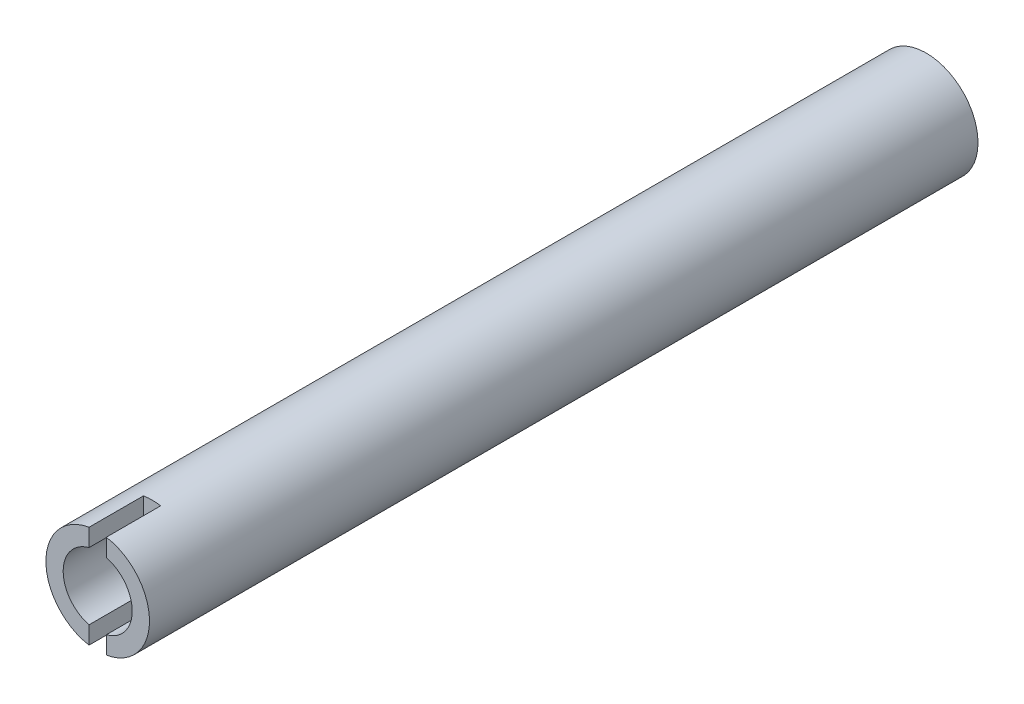
ISO-10303-21;
HEADER;
FILE_DESCRIPTION(('STEP AP214'),'2;1');
FILE_NAME('part.step','',(''),(''),'','','');
FILE_SCHEMA(('AUTOMOTIVE_DESIGN { 1 0 10303 214 1 1 1 1 }'));
ENDSEC;
DATA;
#1=APPLICATION_CONTEXT('core data for automotive mechanical design processes');
#2=APPLICATION_PROTOCOL_DEFINITION('international standard','automotive_design',2000,#1);
#3=PRODUCT_CONTEXT('',#1,'mechanical');
#4=PRODUCT('Part','Part','',(#3));
#5=PRODUCT_RELATED_PRODUCT_CATEGORY('part','',(#4));
#6=PRODUCT_DEFINITION_FORMATION('','',#4);
#7=PRODUCT_DEFINITION_CONTEXT('part definition',#1,'design');
#8=PRODUCT_DEFINITION('design','',#6,#7);
#9=PRODUCT_DEFINITION_SHAPE('','',#8);
#10=(LENGTH_UNIT() NAMED_UNIT(*) SI_UNIT(.MILLI.,.METRE.));
#11=(NAMED_UNIT(*) PLANE_ANGLE_UNIT() SI_UNIT($,.RADIAN.));
#12=(NAMED_UNIT(*) SI_UNIT($,.STERADIAN.) SOLID_ANGLE_UNIT());
#13=UNCERTAINTY_MEASURE_WITH_UNIT(LENGTH_MEASURE(1.E-05),#10,'distance_accuracy_value','');
#14=(GEOMETRIC_REPRESENTATION_CONTEXT(3) GLOBAL_UNCERTAINTY_ASSIGNED_CONTEXT((#13)) GLOBAL_UNIT_ASSIGNED_CONTEXT((#10,
#11,#12)) REPRESENTATION_CONTEXT('',''));
#15=CARTESIAN_POINT('',(0.,0.,0.));
#16=DIRECTION('',(0.,0.,1.));
#17=DIRECTION('',(1.,0.,0.));
#18=AXIS2_PLACEMENT_3D('',#15,#16,#17);
#19=CARTESIAN_POINT('',(0.,0.,152.4));
#20=DIRECTION('',(0.,0.,1.));
#21=DIRECTION('',(1.,0.,0.));
#22=AXIS2_PLACEMENT_3D('',#19,#20,#21);
#23=PLANE('',#22);
#24=DIRECTION('',(0.,1.,0.));
#25=VECTOR('',#24,1.);
#26=CARTESIAN_POINT('',(1.5875,12.589531725546,152.4));
#27=LINE('',#26,#25);
#28=CARTESIAN_POINT('',(1.5875,-9.39177665567064,152.4));
#29=VERTEX_POINT('',#28);
#30=CARTESIAN_POINT('',(1.5875,-6.14836106210427,152.4));
#31=VERTEX_POINT('',#30);
#32=EDGE_CURVE('E104',#29,#31,#27,.T.);
#33=ORIENTED_EDGE('',*,*,#32,.F.);
#34=CARTESIAN_POINT('',(0.,0.,152.4));
#35=DIRECTION('',(0.,0.,1.));
#36=DIRECTION('',(1.,0.,0.));
#37=AXIS2_PLACEMENT_3D('',#34,#35,#36);
#38=CIRCLE('',#37,9.525);
#39=CARTESIAN_POINT('',(1.5875,9.39177665567064,152.4));
#40=VERTEX_POINT('',#39);
#41=EDGE_CURVE('E116',#29,#40,#38,.T.);
#42=ORIENTED_EDGE('',*,*,#41,.T.);
#43=CARTESIAN_POINT('',(1.5875,6.14836106210427,152.4));
#44=VERTEX_POINT('',#43);
#45=EDGE_CURVE('E120',#44,#40,#27,.T.);
#46=ORIENTED_EDGE('',*,*,#45,.F.);
#47=CARTESIAN_POINT('',(0.,0.,152.4));
#48=DIRECTION('',(0.,0.,1.));
#49=DIRECTION('',(1.,0.,0.));
#50=AXIS2_PLACEMENT_3D('',#47,#48,#49);
#51=CIRCLE('',#50,6.35);
#52=EDGE_CURVE('E118',#31,#44,#51,.T.);
#53=ORIENTED_EDGE('',*,*,#52,.F.);
#54=EDGE_LOOP('',(#33,#42,#46,#53));
#55=FACE_BOUND('',#54,.T.);
#56=ADVANCED_FACE('F38',(#55),#23,.T.);
#57=DIRECTION('',(0.,-1.,0.));
#58=VECTOR('',#57,1.);
#59=CARTESIAN_POINT('',(-1.5875,12.589531725546,152.4));
#60=LINE('',#59,#58);
#61=CARTESIAN_POINT('',(-1.5875,9.39177665567064,152.4));
#62=VERTEX_POINT('',#61);
#63=CARTESIAN_POINT('',(-1.5875,6.14836106210427,152.4));
#64=VERTEX_POINT('',#63);
#65=EDGE_CURVE('E157',#62,#64,#60,.T.);
#66=ORIENTED_EDGE('',*,*,#65,.F.);
#67=CARTESIAN_POINT('',(-1.5875,-9.39177665567064,152.4));
#68=VERTEX_POINT('',#67);
#69=EDGE_CURVE('E125',#62,#68,#38,.T.);
#70=ORIENTED_EDGE('',*,*,#69,.T.);
#71=CARTESIAN_POINT('',(-1.5875,-6.14836106210427,152.4));
#72=VERTEX_POINT('',#71);
#73=EDGE_CURVE('E119',#72,#68,#60,.T.);
#74=ORIENTED_EDGE('',*,*,#73,.F.);
#75=EDGE_CURVE('E131',#64,#72,#51,.T.);
#76=ORIENTED_EDGE('',*,*,#75,.F.);
#77=EDGE_LOOP('',(#66,#70,#74,#76));
#78=FACE_BOUND('',#77,.T.);
#79=ADVANCED_FACE('F189',(#78),#23,.T.);
#80=CARTESIAN_POINT('',(0.,0.,0.));
#81=DIRECTION('',(0.,0.,1.));
#82=DIRECTION('',(1.,0.,0.));
#83=AXIS2_PLACEMENT_3D('',#80,#81,#82);
#84=PLANE('',#83);
#85=CARTESIAN_POINT('',(0.,0.,0.));
#86=DIRECTION('',(0.,0.,1.));
#87=DIRECTION('',(1.,0.,0.));
#88=AXIS2_PLACEMENT_3D('',#85,#86,#87);
#89=CIRCLE('',#88,9.525);
#90=CARTESIAN_POINT('',(9.525,0.,0.));
#91=VERTEX_POINT('',#90);
#92=EDGE_CURVE('E126',#91,#91,#89,.T.);
#93=ORIENTED_EDGE('',*,*,#92,.F.);
#94=EDGE_LOOP('',(#93));
#95=FACE_BOUND('',#94,.T.);
#96=CARTESIAN_POINT('',(0.,0.,0.));
#97=DIRECTION('',(0.,0.,1.));
#98=DIRECTION('',(1.,0.,0.));
#99=AXIS2_PLACEMENT_3D('',#96,#97,#98);
#100=CIRCLE('',#99,6.35);
#101=CARTESIAN_POINT('',(6.35,0.,0.));
#102=VERTEX_POINT('',#101);
#103=EDGE_CURVE('E109',#102,#102,#100,.T.);
#104=ORIENTED_EDGE('',*,*,#103,.T.);
#105=EDGE_LOOP('',(#104));
#106=FACE_BOUND('',#105,.T.);
#107=ADVANCED_FACE('F176',(#95,#106),#84,.F.);
#108=CARTESIAN_POINT('',(0.,0.,152.4));
#109=DIRECTION('',(0.,0.,-1.));
#110=DIRECTION('',(-1.,0.,0.));
#111=AXIS2_PLACEMENT_3D('',#108,#109,#110);
#112=CYLINDRICAL_SURFACE('',#111,9.525);
#113=CARTESIAN_POINT('',(0.,0.,142.4));
#114=DIRECTION('',(0.,0.,1.));
#115=DIRECTION('',(1.,0.,0.));
#116=AXIS2_PLACEMENT_3D('',#113,#114,#115);
#117=CIRCLE('',#116,9.525);
#118=CARTESIAN_POINT('',(1.5875,9.39177665567064,142.4));
#119=VERTEX_POINT('',#118);
#120=CARTESIAN_POINT('',(-1.5875,9.39177665567064,142.4));
#121=VERTEX_POINT('',#120);
#122=EDGE_CURVE('E166',#119,#121,#117,.T.);
#123=ORIENTED_EDGE('',*,*,#122,.F.);
#124=DIRECTION('',(0.,0.,-1.));
#125=VECTOR('',#124,1.);
#126=CARTESIAN_POINT('',(1.5875,9.39177665567064,152.4));
#127=LINE('',#126,#125);
#128=EDGE_CURVE('E110',#119,#40,#127,.F.);
#129=ORIENTED_EDGE('',*,*,#128,.T.);
#130=ORIENTED_EDGE('',*,*,#41,.F.);
#131=DIRECTION('',(0.,0.,-1.));
#132=VECTOR('',#131,1.);
#133=CARTESIAN_POINT('',(1.5875,-9.39177665567064,152.4));
#134=LINE('',#133,#132);
#135=CARTESIAN_POINT('',(1.5875,-9.39177665567064,142.4));
#136=VERTEX_POINT('',#135);
#137=EDGE_CURVE('E101',#29,#136,#134,.T.);
#138=ORIENTED_EDGE('',*,*,#137,.T.);
#139=CARTESIAN_POINT('',(-1.5875,-9.39177665567064,142.4));
#140=VERTEX_POINT('',#139);
#141=EDGE_CURVE('E164',#140,#136,#117,.T.);
#142=ORIENTED_EDGE('',*,*,#141,.F.);
#143=DIRECTION('',(0.,0.,-1.));
#144=VECTOR('',#143,1.);
#145=CARTESIAN_POINT('',(-1.5875,-9.39177665567064,152.4));
#146=LINE('',#145,#144);
#147=EDGE_CURVE('E167',#140,#68,#146,.F.);
#148=ORIENTED_EDGE('',*,*,#147,.T.);
#149=ORIENTED_EDGE('',*,*,#69,.F.);
#150=DIRECTION('',(0.,0.,-1.));
#151=VECTOR('',#150,1.);
#152=CARTESIAN_POINT('',(-1.5875,9.39177665567064,152.4));
#153=LINE('',#152,#151);
#154=EDGE_CURVE('E170',#62,#121,#153,.T.);
#155=ORIENTED_EDGE('',*,*,#154,.T.);
#156=EDGE_LOOP('',(#123,#129,#130,#138,#142,#148,#149,#155));
#157=FACE_BOUND('',#156,.T.);
#158=ORIENTED_EDGE('',*,*,#92,.T.);
#159=EDGE_LOOP('',(#158));
#160=FACE_BOUND('',#159,.T.);
#161=ADVANCED_FACE('F40',(#157,#160),#112,.T.);
#162=CARTESIAN_POINT('',(0.,0.,152.4));
#163=DIRECTION('',(0.,0.,-1.));
#164=DIRECTION('',(-1.,0.,0.));
#165=AXIS2_PLACEMENT_3D('',#162,#163,#164);
#166=CYLINDRICAL_SURFACE('',#165,6.35);
#167=DIRECTION('',(0.,0.,-1.));
#168=VECTOR('',#167,1.);
#169=CARTESIAN_POINT('',(1.5875,6.14836106210427,152.4));
#170=LINE('',#169,#168);
#171=CARTESIAN_POINT('',(1.5875,6.14836106210427,142.4));
#172=VERTEX_POINT('',#171);
#173=EDGE_CURVE('E11',#172,#44,#170,.F.);
#174=ORIENTED_EDGE('',*,*,#173,.F.);
#175=CARTESIAN_POINT('',(0.,0.,142.4));
#176=DIRECTION('',(0.,0.,1.));
#177=DIRECTION('',(1.,0.,0.));
#178=AXIS2_PLACEMENT_3D('',#175,#176,#177);
#179=CIRCLE('',#178,6.35);
#180=CARTESIAN_POINT('',(-1.5875,6.14836106210427,142.4));
#181=VERTEX_POINT('',#180);
#182=EDGE_CURVE('E139',#172,#181,#179,.T.);
#183=ORIENTED_EDGE('',*,*,#182,.T.);
#184=DIRECTION('',(0.,0.,-1.));
#185=VECTOR('',#184,1.);
#186=CARTESIAN_POINT('',(-1.5875,6.14836106210427,152.4));
#187=LINE('',#186,#185);
#188=EDGE_CURVE('E46',#64,#181,#187,.T.);
#189=ORIENTED_EDGE('',*,*,#188,.F.);
#190=ORIENTED_EDGE('',*,*,#75,.T.);
#191=DIRECTION('',(0.,0.,-1.));
#192=VECTOR('',#191,1.);
#193=CARTESIAN_POINT('',(-1.5875,-6.14836106210427,152.4));
#194=LINE('',#193,#192);
#195=CARTESIAN_POINT('',(-1.5875,-6.14836106210427,142.4));
#196=VERTEX_POINT('',#195);
#197=EDGE_CURVE('E138',#196,#72,#194,.F.);
#198=ORIENTED_EDGE('',*,*,#197,.F.);
#199=CARTESIAN_POINT('',(1.5875,-6.14836106210427,142.4));
#200=VERTEX_POINT('',#199);
#201=EDGE_CURVE('E129',#196,#200,#179,.T.);
#202=ORIENTED_EDGE('',*,*,#201,.T.);
#203=DIRECTION('',(0.,0.,-1.));
#204=VECTOR('',#203,1.);
#205=CARTESIAN_POINT('',(1.5875,-6.14836106210427,152.4));
#206=LINE('',#205,#204);
#207=EDGE_CURVE('E141',#31,#200,#206,.T.);
#208=ORIENTED_EDGE('',*,*,#207,.F.);
#209=ORIENTED_EDGE('',*,*,#52,.T.);
#210=EDGE_LOOP('',(#174,#183,#189,#190,#198,#202,#208,#209));
#211=FACE_BOUND('',#210,.T.);
#212=ORIENTED_EDGE('',*,*,#103,.F.);
#213=EDGE_LOOP('',(#212));
#214=FACE_BOUND('',#213,.T.);
#215=ADVANCED_FACE('F147',(#211,#214),#166,.F.);
#216=CARTESIAN_POINT('',(0.,0.,142.4));
#217=DIRECTION('',(0.,0.,1.));
#218=DIRECTION('',(1.,0.,0.));
#219=AXIS2_PLACEMENT_3D('',#216,#217,#218);
#220=PLANE('',#219);
#221=ORIENTED_EDGE('',*,*,#141,.T.);
#222=DIRECTION('',(0.,1.,0.));
#223=VECTOR('',#222,1.);
#224=CARTESIAN_POINT('',(1.5875,12.589531725546,142.4));
#225=LINE('',#224,#223);
#226=EDGE_CURVE('E61',#136,#200,#225,.T.);
#227=ORIENTED_EDGE('',*,*,#226,.T.);
#228=ORIENTED_EDGE('',*,*,#201,.F.);
#229=DIRECTION('',(0.,-1.,0.));
#230=VECTOR('',#229,1.);
#231=CARTESIAN_POINT('',(-1.5875,12.589531725546,142.4));
#232=LINE('',#231,#230);
#233=EDGE_CURVE('E159',#196,#140,#232,.T.);
#234=ORIENTED_EDGE('',*,*,#233,.T.);
#235=EDGE_LOOP('',(#221,#227,#228,#234));
#236=FACE_BOUND('',#235,.T.);
#237=ADVANCED_FACE('F178',(#236),#220,.T.);
#238=CARTESIAN_POINT('',(-1.5875,12.589531725546,142.4));
#239=DIRECTION('',(-1.,0.,0.));
#240=DIRECTION('',(0.,-1.,0.));
#241=AXIS2_PLACEMENT_3D('',#238,#239,#240);
#242=PLANE('',#241);
#243=ORIENTED_EDGE('',*,*,#233,.F.);
#244=ORIENTED_EDGE('',*,*,#197,.T.);
#245=ORIENTED_EDGE('',*,*,#73,.T.);
#246=ORIENTED_EDGE('',*,*,#147,.F.);
#247=EDGE_LOOP('',(#243,#244,#245,#246));
#248=FACE_BOUND('',#247,.T.);
#249=ADVANCED_FACE('F184',(#248),#242,.F.);
#250=CARTESIAN_POINT('',(1.5875,12.589531725546,142.4));
#251=DIRECTION('',(1.,0.,0.));
#252=DIRECTION('',(0.,1.,0.));
#253=AXIS2_PLACEMENT_3D('',#250,#251,#252);
#254=PLANE('',#253);
#255=ORIENTED_EDGE('',*,*,#32,.T.);
#256=ORIENTED_EDGE('',*,*,#207,.T.);
#257=ORIENTED_EDGE('',*,*,#226,.F.);
#258=ORIENTED_EDGE('',*,*,#137,.F.);
#259=EDGE_LOOP('',(#255,#256,#257,#258));
#260=FACE_BOUND('',#259,.T.);
#261=ADVANCED_FACE('F103',(#260),#254,.F.);
#262=EDGE_CURVE('E154',#172,#119,#225,.T.);
#263=ORIENTED_EDGE('',*,*,#262,.F.);
#264=ORIENTED_EDGE('',*,*,#173,.T.);
#265=ORIENTED_EDGE('',*,*,#45,.T.);
#266=ORIENTED_EDGE('',*,*,#128,.F.);
#267=EDGE_LOOP('',(#263,#264,#265,#266));
#268=FACE_BOUND('',#267,.T.);
#269=ADVANCED_FACE('F156',(#268),#254,.F.);
#270=ORIENTED_EDGE('',*,*,#65,.T.);
#271=ORIENTED_EDGE('',*,*,#188,.T.);
#272=EDGE_CURVE('E53',#121,#181,#232,.T.);
#273=ORIENTED_EDGE('',*,*,#272,.F.);
#274=ORIENTED_EDGE('',*,*,#154,.F.);
#275=EDGE_LOOP('',(#270,#271,#273,#274));
#276=FACE_BOUND('',#275,.T.);
#277=ADVANCED_FACE('F229',(#276),#242,.F.);
#278=ORIENTED_EDGE('',*,*,#122,.T.);
#279=ORIENTED_EDGE('',*,*,#272,.T.);
#280=ORIENTED_EDGE('',*,*,#182,.F.);
#281=ORIENTED_EDGE('',*,*,#262,.T.);
#282=EDGE_LOOP('',(#278,#279,#280,#281));
#283=FACE_BOUND('',#282,.T.);
#284=ADVANCED_FACE('F153',(#283),#220,.T.);
#285=CLOSED_SHELL('',(#56,#79,#107,#161,#215,#237,#249,#261,#269,#277,#284));
#286=MANIFOLD_SOLID_BREP('B2',#285);
#287=ADVANCED_BREP_SHAPE_REPRESENTATION('',(#18,#286),#14);
#288=SHAPE_DEFINITION_REPRESENTATION(#9,#287);
ENDSEC;
END-ISO-10303-21;
